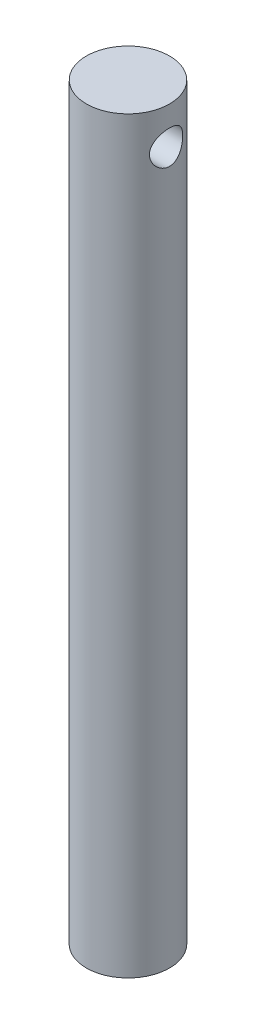
ISO-10303-21;
HEADER;
FILE_DESCRIPTION(('STEP AP214'),'2;1');
FILE_NAME('part.step','',(''),(''),'','','');
FILE_SCHEMA(('AUTOMOTIVE_DESIGN { 1 0 10303 214 1 1 1 1 }'));
ENDSEC;
DATA;
#1=APPLICATION_CONTEXT('core data for automotive mechanical design processes');
#2=APPLICATION_PROTOCOL_DEFINITION('international standard','automotive_design',2000,#1);
#3=PRODUCT_CONTEXT('',#1,'mechanical');
#4=PRODUCT('Part','Part','',(#3));
#5=PRODUCT_RELATED_PRODUCT_CATEGORY('part','',(#4));
#6=PRODUCT_DEFINITION_FORMATION('','',#4);
#7=PRODUCT_DEFINITION_CONTEXT('part definition',#1,'design');
#8=PRODUCT_DEFINITION('design','',#6,#7);
#9=PRODUCT_DEFINITION_SHAPE('','',#8);
#10=(LENGTH_UNIT() NAMED_UNIT(*) SI_UNIT(.MILLI.,.METRE.));
#11=(NAMED_UNIT(*) PLANE_ANGLE_UNIT() SI_UNIT($,.RADIAN.));
#12=(NAMED_UNIT(*) SI_UNIT($,.STERADIAN.) SOLID_ANGLE_UNIT());
#13=UNCERTAINTY_MEASURE_WITH_UNIT(LENGTH_MEASURE(1.E-05),#10,'distance_accuracy_value','');
#14=(GEOMETRIC_REPRESENTATION_CONTEXT(3) GLOBAL_UNCERTAINTY_ASSIGNED_CONTEXT((#13)) GLOBAL_UNIT_ASSIGNED_CONTEXT((#10,
#11,#12)) REPRESENTATION_CONTEXT('',''));
#15=CARTESIAN_POINT('',(0.,0.,0.));
#16=DIRECTION('',(0.,0.,1.));
#17=DIRECTION('',(1.,0.,0.));
#18=AXIS2_PLACEMENT_3D('',#15,#16,#17);
#19=CARTESIAN_POINT('',(0.,180.,0.));
#20=DIRECTION('',(0.,-1.,0.));
#21=DIRECTION('',(0.,0.,-1.));
#22=AXIS2_PLACEMENT_3D('',#19,#20,#21);
#23=CYLINDRICAL_SURFACE('',#22,10.);
#24=CARTESIAN_POINT('',(-10.,167.,0.));
#25=CARTESIAN_POINT('',(-9.99999886871264,167.000001574933,-0.107549581345537));
#26=CARTESIAN_POINT('',(-9.99825999367799,167.00434367108,-0.215132147940362));
#27=CARTESIAN_POINT('',(-9.99134740691108,167.021673382784,-0.429535200549549));
#28=CARTESIAN_POINT('',(-9.98617152790588,167.034666453403,-0.536355162703302));
#29=CARTESIAN_POINT('',(-9.97250573560117,167.069208034551,-0.748635856497416));
#30=CARTESIAN_POINT('',(-9.96400865312143,167.09077505462,-0.854093134440868));
#31=CARTESIAN_POINT('',(-9.94393017211574,167.142241730437,-1.06266761114009));
#32=CARTESIAN_POINT('',(-9.932347522545,167.172144766255,-1.16578384227259));
#33=CARTESIAN_POINT('',(-9.89349112162205,167.273722808716,-1.46979509681069));
#34=CARTESIAN_POINT('',(-9.86204458846134,167.357421819006,-1.66629107461992));
#35=CARTESIAN_POINT('',(-9.79113035538708,167.55404621735,-2.04217417878101));
#36=CARTESIAN_POINT('',(-9.75166544086262,167.666961460115,-2.22156721456798));
#37=CARTESIAN_POINT('',(-9.66661825353092,167.924468754522,-2.56699339938209));
#38=CARTESIAN_POINT('',(-9.62084608086599,168.070212710576,-2.73212223266508));
#39=CARTESIAN_POINT('',(-9.52921139577231,168.386800609152,-3.03635232313263));
#40=CARTESIAN_POINT('',(-9.48334885017047,168.557656759017,-3.17544084661153));
#41=CARTESIAN_POINT('',(-9.39445587657958,168.928855968566,-3.42974847409895));
#42=CARTESIAN_POINT('',(-9.35164233015934,169.130172926064,-3.54362978572888));
#43=CARTESIAN_POINT('',(-9.2766729328807,169.551072842801,-3.73550961465235));
#44=CARTESIAN_POINT('',(-9.24451202207145,169.770647067741,-3.81352517485724));
#45=CARTESIAN_POINT('',(-9.19652715590089,170.211424655686,-3.92779760260542));
#46=CARTESIAN_POINT('',(-9.18002840771385,170.432102468088,-3.96578791979826));
#47=CARTESIAN_POINT('',(-9.16328008038142,170.877269999677,-4.00434593508728));
#48=CARTESIAN_POINT('',(-9.16302251073202,171.101757790011,-4.00493203570086));
#49=CARTESIAN_POINT('',(-9.17821000534301,171.531513342223,-3.9699787321474));
#50=CARTESIAN_POINT('',(-9.19256349925666,171.737031428766,-3.93695062778272));
#51=CARTESIAN_POINT('',(-9.23352375055553,172.13931911235,-3.83989376129508));
#52=CARTESIAN_POINT('',(-9.26013264599921,172.336087176306,-3.77585958980135));
#53=CARTESIAN_POINT('',(-9.32318970221161,172.720035672292,-3.61738946491141));
#54=CARTESIAN_POINT('',(-9.35982758573423,172.906938478082,-3.5223597245794));
#55=CARTESIAN_POINT('',(-9.43876232767926,173.26283163275,-3.30501292151571));
#56=CARTESIAN_POINT('',(-9.48106130910411,173.431815218813,-3.18268561021591));
#57=CARTESIAN_POINT('',(-9.57053473488081,173.760819457596,-2.90310119889357));
#58=CARTESIAN_POINT('',(-9.61783329953252,173.91913745889,-2.74387492593718));
#59=CARTESIAN_POINT('',(-9.70919649915615,174.207368956006,-2.4006288548645));
#60=CARTESIAN_POINT('',(-9.75326048890393,174.337276794821,-2.21660413066997));
#61=CARTESIAN_POINT('',(-9.83429362529358,174.567234894831,-1.82415530521055));
#62=CARTESIAN_POINT('',(-9.87110540190899,174.666644562394,-1.61532098269266));
#63=CARTESIAN_POINT('',(-9.93229656657448,174.828335722156,-1.18204753096607));
#64=CARTESIAN_POINT('',(-9.95668226924746,174.890636075115,-0.957616393699408));
#65=CARTESIAN_POINT('',(-9.98912279013839,174.972896590839,-0.513791775215602));
#66=CARTESIAN_POINT('',(-9.99805891667034,174.995144908507,-0.294886587971151));
#67=CARTESIAN_POINT('',(-10.0013695702126,175.003426201057,0.143690619615697));
#68=CARTESIAN_POINT('',(-9.99574787164577,174.989468563095,0.363362426448175));
#69=CARTESIAN_POINT('',(-9.97115134127512,174.927416494896,0.786865478243648));
#70=CARTESIAN_POINT('',(-9.95278782691064,174.880884039297,0.990964983549754));
#71=CARTESIAN_POINT('',(-9.90518882810983,174.757128583381,1.38827085612274));
#72=CARTESIAN_POINT('',(-9.87595194712999,174.679901640665,1.58147582045412));
#73=CARTESIAN_POINT('',(-9.80833189541687,174.494430120638,1.95815757162884));
#74=CARTESIAN_POINT('',(-9.76969631959847,174.385309055905,2.14115604549354));
#75=CARTESIAN_POINT('',(-9.68746729490809,174.140119352197,2.4868871825104));
#76=CARTESIAN_POINT('',(-9.64387186219642,174.004039914186,2.64961168158684));
#77=CARTESIAN_POINT('',(-9.55290235277181,173.698259974067,2.96144608598878));
#78=CARTESIAN_POINT('',(-9.50546882853787,173.526932916859,3.10894786734726));
#79=CARTESIAN_POINT('',(-9.4148334583058,173.16111983411,3.37350239509235));
#80=CARTESIAN_POINT('',(-9.37163231039242,172.966629999801,3.4905501236659));
#81=CARTESIAN_POINT('',(-9.2942859982933,172.557076610327,3.69161500286276));
#82=CARTESIAN_POINT('',(-9.26023261821741,172.341831999756,3.77530118531766));
#83=CARTESIAN_POINT('',(-9.20647346903737,171.898532698387,3.90459244315908));
#84=CARTESIAN_POINT('',(-9.18675711197461,171.670487595158,3.95022562452798));
#85=CARTESIAN_POINT('',(-9.16543518780389,171.225744190156,3.99943122157417));
#86=CARTESIAN_POINT('',(-9.16262842667612,171.009410298105,4.0057941177721));
#87=CARTESIAN_POINT('',(-9.17229671415009,170.578910307279,3.98360636538275));
#88=CARTESIAN_POINT('',(-9.18476982225497,170.364743936718,3.9550601501471));
#89=CARTESIAN_POINT('',(-9.2225330048627,169.95333553911,3.8661425648813));
#90=CARTESIAN_POINT('',(-9.2472967218297,169.755759153779,3.80707437387707));
#91=CARTESIAN_POINT('',(-9.30647993934965,169.37324303821,3.66001151041638));
#92=CARTESIAN_POINT('',(-9.34090210615104,169.188306814889,3.57200884934551));
#93=CARTESIAN_POINT('',(-9.4179725282647,168.824779589291,3.36374310804135));
#94=CARTESIAN_POINT('',(-9.46097893410836,168.647158169312,3.24192140926545));
#95=CARTESIAN_POINT('',(-9.54927479921251,168.314017857375,2.97179350239179));
#96=CARTESIAN_POINT('',(-9.59456494363941,168.15850565271,2.82347931168582));
#97=CARTESIAN_POINT('',(-9.68587647140964,167.863576407469,2.49297412446701));
#98=CARTESIAN_POINT('',(-9.73175488236392,167.725856616018,2.30921017071957));
#99=CARTESIAN_POINT('',(-9.7949502762577,167.543951891062,2.01716584575534));
#100=CARTESIAN_POINT('',(-9.81509269692655,167.487392936147,1.91699501972425));
#101=CARTESIAN_POINT('',(-9.85294835133019,167.382962004595,1.71180110982479));
#102=CARTESIAN_POINT('',(-9.87066269647665,167.335086050192,1.60678027559742));
#103=CARTESIAN_POINT('',(-9.9028559935491,167.249252015315,1.39454646904328));
#104=CARTESIAN_POINT('',(-9.91738778532477,167.211129845253,1.28740777135871));
#105=CARTESIAN_POINT('',(-9.94319722915714,167.144078652279,1.06995577523382));
#106=CARTESIAN_POINT('',(-9.95447639837582,167.11514534265,0.95964398335261));
#107=CARTESIAN_POINT('',(-9.97343330649399,167.066825163851,0.736945215856827));
#108=CARTESIAN_POINT('',(-9.98112017494336,167.047414088355,0.624564263591271));
#109=CARTESIAN_POINT('',(-9.99270031578293,167.018261429334,0.398419132407595));
#110=CARTESIAN_POINT('',(-9.99659628445551,167.008512973166,0.284655994966348));
#111=CARTESIAN_POINT('',(-9.99951445883957,167.001214104427,0.11383046342549));
#112=CARTESIAN_POINT('',(-10.0000005987258,166.999999166478,0.0569198512645288));
#113=CARTESIAN_POINT('',(-10.,167.,0.));
#114=B_SPLINE_CURVE_WITH_KNOTS('',3,(#24,#25,#26,#27,#28,#29,#30,#31,#32,#33,#34,#35,#36,#37,
#38,#39,#40,#41,#42,#43,#44,#45,#46,#47,#48,#49,#50,#51,#52,#53,#54,#55,#56,#57,#58,#59,#60,#61,
#62,#63,#64,#65,#66,#67,#68,#69,#70,#71,#72,#73,#74,#75,#76,#77,#78,#79,#80,#81,#82,#83,#84,#85,
#86,#87,#88,#89,#90,#91,#92,#93,#94,#95,#96,#97,#98,#99,#100,#101,#102,#103,#104,#105,#106,#107,
#108,#109,#110,#111,#112,#113),.UNSPECIFIED.,.T.,.F.,(4,2,2,2,2,2,2,2,2,2,2,2,2,2,2,2,2,2,2,2,2,
2,2,2,2,2,2,2,2,2,2,2,2,2,2,2,2,2,2,2,2,2,2,2,4),(0.,0.322603993422156,0.645411604786482,
0.968919914471232,1.29255959093094,1.93701523385824,2.58124739027476,3.25313995292303,
3.92536021760331,4.62749749529945,5.32930078128046,5.99927442509166,6.66891844572486,
7.29195888698824,7.91510806412269,8.55097484497805,9.1870807577654,9.87235930273287,
10.5577741757964,11.2567305822579,11.9553314412776,12.6125760095619,13.2696501904034,
13.8972014302891,14.5248332988777,15.171662586967,15.8187515089811,16.50856181149,
17.1984856998767,17.8950932218183,18.5911857719204,19.2371857868567,19.8831037702626,
20.5034786899771,21.124025035105,21.7801016801356,22.4363763459696,23.1352007896785,
23.4851924266232,23.8350233218042,24.1785111324565,24.52183846562,24.8642884495951,
25.2064946871486,25.3772305569977),.UNSPECIFIED.);
#115=CARTESIAN_POINT('',(-10.,167.,0.));
#116=VERTEX_POINT('',#115);
#117=EDGE_CURVE('E10',#116,#116,#114,.T.);
#118=ORIENTED_EDGE('',*,*,#117,.T.);
#119=EDGE_LOOP('',(#118));
#120=FACE_BOUND('',#119,.T.);
#121=CARTESIAN_POINT('',(9.16515138991168,171.,-4.));
#122=CARTESIAN_POINT('',(9.16515220722506,170.892822503216,-3.99999917996685));
#123=CARTESIAN_POINT('',(9.16703782704588,170.785612140205,-3.99568627578832));
#124=CARTESIAN_POINT('',(9.17451890581268,170.571967905829,-3.97847804504316));
#125=CARTESIAN_POINT('',(9.18011663538446,170.465534550055,-3.965577465543));
#126=CARTESIAN_POINT('',(9.19485078616074,170.254064046644,-3.9312935770878));
#127=CARTESIAN_POINT('',(9.20399425848326,170.149030115151,-3.90989336356572));
#128=CARTESIAN_POINT('',(9.22551446198259,169.94131240281,-3.85883937208579));
#129=CARTESIAN_POINT('',(9.23789253541712,169.838629616898,-3.82918216740128));
#130=CARTESIAN_POINT('',(9.27920231487636,169.536010273371,-3.72849978450445));
#131=CARTESIAN_POINT('',(9.31238810193524,169.340462079036,-3.64559228099564));
#132=CARTESIAN_POINT('',(9.38629512671437,168.966198731327,-3.4508325645389));
#133=CARTESIAN_POINT('',(9.42701471853534,168.787479914109,-3.33898667159604));
#134=CARTESIAN_POINT('',(9.51401677460926,168.441488186399,-3.08264624953204));
#135=CARTESIAN_POINT('',(9.56047821792021,168.275289566711,-2.93675933272146));
#136=CARTESIAN_POINT('',(9.65224928088017,167.968939591958,-2.61941759406607));
#137=CARTESIAN_POINT('',(9.69755849326326,167.828797339245,-2.4479538749543));
#138=CARTESIAN_POINT('',(9.78406811808173,167.573187890163,-2.07601279575006));
#139=CARTESIAN_POINT('',(9.82503606295845,167.458911580031,-1.87465797803876));
#140=CARTESIAN_POINT('',(9.89607856333948,167.266312680323,-1.45365059895516));
#141=CARTESIAN_POINT('',(9.92615755049622,167.187975460567,-1.23400552632836));
#142=CARTESIAN_POINT('',(9.97076649749864,167.073317072677,-0.793932865332448));
#143=CARTESIAN_POINT('',(9.98597873479394,167.035145384002,-0.574057972725544));
#144=CARTESIAN_POINT('',(10.001606214367,166.995943016499,-0.130532654160175));
#145=CARTESIAN_POINT('',(10.0020269755724,166.994898484955,0.0931163324631064));
#146=CARTESIAN_POINT('',(9.98843925626006,167.028965542546,0.524464988663922));
#147=CARTESIAN_POINT('',(9.97523993538891,167.062049546297,0.73235490554245));
#148=CARTESIAN_POINT('',(9.93698582942363,167.159985751818,1.13934621864229));
#149=CARTESIAN_POINT('',(9.91193017443785,167.224840284584,1.33844696883603));
#150=CARTESIAN_POINT('',(9.85193648913816,167.385272965972,1.72579587696675));
#151=CARTESIAN_POINT('',(9.81685520932147,167.481299429689,1.91383524674319));
#152=CARTESIAN_POINT('',(9.7402917036085,167.70093001378,2.27161630149723));
#153=CARTESIAN_POINT('',(9.69880728534381,167.824543586184,2.44135168543995));
#154=CARTESIAN_POINT('',(9.61043274352157,168.105298271905,2.76953765597606));
#155=CARTESIAN_POINT('',(9.56336653023493,168.26410778515,2.92651569053149));
#156=CARTESIAN_POINT('',(9.47123321946549,168.605981143659,3.21221483078646));
#157=CARTESIAN_POINT('',(9.42616678016159,168.78905289639,3.34092668757428));
#158=CARTESIAN_POINT('',(9.34193794818039,169.180838044749,3.56980837743823));
#159=CARTESIAN_POINT('',(9.30297828115413,169.390129660678,3.66906930327245));
#160=CARTESIAN_POINT('',(9.23775180688171,169.824430980624,3.83035251973301));
#161=CARTESIAN_POINT('',(9.21147675782622,170.049430369453,3.89239899675599));
#162=CARTESIAN_POINT('',(9.17659519405432,170.494071554935,3.97390989770977));
#163=CARTESIAN_POINT('',(9.16700732912276,170.713200894257,3.99574419362908));
#164=CARTESIAN_POINT('',(9.16378995738077,171.152154415519,4.00312265288578));
#165=CARTESIAN_POINT('',(9.17015561120724,171.371978366551,3.98867782118258));
#166=CARTESIAN_POINT('',(9.19712088718227,171.792917869914,3.92606578958006));
#167=CARTESIAN_POINT('',(9.21688915596603,171.9943858748,3.87986612404772));
#168=CARTESIAN_POINT('',(9.26740102054679,172.386576809571,3.75760837382176));
#169=CARTESIAN_POINT('',(9.29814704977195,172.577297346215,3.6815436686046));
#170=CARTESIAN_POINT('',(9.36867563720203,172.951204715591,3.49827127896311));
#171=CARTESIAN_POINT('',(9.40877409278357,173.133772377387,3.38992573652915));
#172=CARTESIAN_POINT('',(9.49300770315588,173.478965974885,3.1463304488838));
#173=CARTESIAN_POINT('',(9.5371444979208,173.641583745598,3.01106974696435));
#174=CARTESIAN_POINT('',(9.62841831942843,173.954746817191,2.70568842336055));
#175=CARTESIAN_POINT('',(9.67553614570507,174.103513130555,2.53373085888854));
#176=CARTESIAN_POINT('',(9.76439589135024,174.370354153248,2.16616726673934));
#177=CARTESIAN_POINT('',(9.80613759186121,174.488427613297,1.97056027694193));
#178=CARTESIAN_POINT('',(9.87967431800929,174.690095252819,1.56055986799734));
#179=CARTESIAN_POINT('',(9.9114717248188,174.773697687947,1.34617096196502));
#180=CARTESIAN_POINT('',(9.96145426937248,174.903097705199,0.904787181861589));
#181=CARTESIAN_POINT('',(9.97964679410119,174.948915804313,0.677799220674816));
#182=CARTESIAN_POINT('',(9.99958016425668,174.999009401911,0.23363302061199));
#183=CARTESIAN_POINT('',(10.0023169350655,175.005800252077,0.0167809848943213));
#184=CARTESIAN_POINT('',(9.99372084740381,174.98428904628,-0.414867671174707));
#185=CARTESIAN_POINT('',(9.98239011871255,174.955992302479,-0.629664597702875));
#186=CARTESIAN_POINT('',(9.94743026789158,174.866906405787,-1.04434180494579));
#187=CARTESIAN_POINT('',(9.92418961491739,174.807142043495,-1.24447761316989));
#188=CARTESIAN_POINT('',(9.86789895440956,174.657894455242,-1.63184470564403));
#189=CARTESIAN_POINT('',(9.83484713776136,174.568405747944,-1.8190736020911));
#190=CARTESIAN_POINT('',(9.76036189588764,174.357793352432,-2.18440609879392));
#191=CARTESIAN_POINT('',(9.71862262764552,174.235446455904,-2.36174083104878));
#192=CARTESIAN_POINT('',(9.63178803063432,173.964423916364,-2.69410799958836));
#193=CARTESIAN_POINT('',(9.58669131729774,173.815737375961,-2.84913115669899));
#194=CARTESIAN_POINT('',(9.49475540255924,173.485365761134,-3.1424027582614));
#195=CARTESIAN_POINT('',(9.4479811565371,173.302207701298,-3.27901865020171));
#196=CARTESIAN_POINT('',(9.3609929250149,172.914130278752,-3.5196940249722));
#197=CARTESIAN_POINT('',(9.32077971107738,172.709208361334,-3.62374968011082));
#198=CARTESIAN_POINT('',(9.25517900642369,172.30187605622,-3.78798515690827));
#199=CARTESIAN_POINT('',(9.22878451494604,172.100892324054,-3.85126569346864));
#200=CARTESIAN_POINT('',(9.19885565843391,171.793361040209,-3.92194632104983));
#201=CARTESIAN_POINT('',(9.19049270633768,171.689926964106,-3.94146052144917));
#202=CARTESIAN_POINT('',(9.17721200341612,171.481643070389,-3.97228850679683));
#203=CARTESIAN_POINT('',(9.17229225293171,171.376794110604,-3.98360705155155));
#204=CARTESIAN_POINT('',(9.16783675423417,171.226449408648,-3.99384232103283));
#205=CARTESIAN_POINT('',(9.16683059815414,171.181200169678,-3.99615058414993));
#206=CARTESIAN_POINT('',(9.16548771864777,171.090635915785,-3.99922965337524));
#207=CARTESIAN_POINT('',(9.16515104430392,171.045320896284,-4.00000034675784));
#208=CARTESIAN_POINT('',(9.16515138991168,171.,-4.));
#209=B_SPLINE_CURVE_WITH_KNOTS('',3,(#121,#122,#123,#124,#125,#126,#127,#128,#129,#130,#131,
#132,#133,#134,#135,#136,#137,#138,#139,#140,#141,#142,#143,#144,#145,#146,#147,#148,#149,#150,
#151,#152,#153,#154,#155,#156,#157,#158,#159,#160,#161,#162,#163,#164,#165,#166,#167,#168,#169,
#170,#171,#172,#173,#174,#175,#176,#177,#178,#179,#180,#181,#182,#183,#184,#185,#186,#187,#188,
#189,#190,#191,#192,#193,#194,#195,#196,#197,#198,#199,#200,#201,#202,#203,#204,#205,#206,#207,
#208),.UNSPECIFIED.,.T.,.F.,(4,2,2,2,2,2,2,2,2,2,2,2,2,2,2,2,2,2,2,2,2,2,2,2,2,2,2,2,2,2,2,2,2,
2,2,2,2,2,2,2,2,2,2,4),(0.,0.321486083338399,0.643168995111178,0.965494918272716,
1.28795480954363,1.92974178448589,2.57138871437638,3.24631250358762,3.92147162486596,
4.6232535197277,5.32474947728873,5.9922837956428,6.65956904401257,7.28937303450519,
7.91922324048033,8.55856614259711,9.19812843669977,9.87968101952625,10.5614562804417,
11.2624893122443,11.9630662339012,12.6208430883876,13.2784204360579,13.898545099602,
14.5188073109319,15.1642232309532,15.8099024284161,16.5032748228387,17.1966754349541,
17.8899098841554,18.5827676569819,19.2304209330182,19.8779761681512,20.5056400267662,
21.1334196944708,21.7889411606976,22.4447344691832,23.1411252036114,23.8375977730829,
24.4715333542806,24.7879924179096,25.1042675432749,25.2402006430819,25.3761437083411),.UNSPECIFIED.);
#210=CARTESIAN_POINT('',(9.16515138991168,171.,-4.));
#211=VERTEX_POINT('',#210);
#212=EDGE_CURVE('E49',#211,#211,#209,.T.);
#213=ORIENTED_EDGE('',*,*,#212,.T.);
#214=EDGE_LOOP('',(#213));
#215=FACE_BOUND('',#214,.T.);
#216=CARTESIAN_POINT('',(0.,180.,0.));
#217=DIRECTION('',(0.,1.,0.));
#218=DIRECTION('',(0.,0.,1.));
#219=AXIS2_PLACEMENT_3D('',#216,#217,#218);
#220=CIRCLE('',#219,10.);
#221=CARTESIAN_POINT('',(0.,180.,10.));
#222=VERTEX_POINT('',#221);
#223=EDGE_CURVE('E54',#222,#222,#220,.T.);
#224=ORIENTED_EDGE('',*,*,#223,.F.);
#225=EDGE_LOOP('',(#224));
#226=FACE_BOUND('',#225,.T.);
#227=CARTESIAN_POINT('',(0.,0.,0.));
#228=DIRECTION('',(0.,1.,0.));
#229=DIRECTION('',(0.,0.,1.));
#230=AXIS2_PLACEMENT_3D('',#227,#228,#229);
#231=CIRCLE('',#230,10.);
#232=CARTESIAN_POINT('',(0.,0.,10.));
#233=VERTEX_POINT('',#232);
#234=EDGE_CURVE('E59',#233,#233,#231,.T.);
#235=ORIENTED_EDGE('',*,*,#234,.T.);
#236=EDGE_LOOP('',(#235));
#237=FACE_BOUND('',#236,.T.);
#238=ADVANCED_FACE('F37',(#120,#215,#226,#237),#23,.T.);
#239=CARTESIAN_POINT('',(0.,180.,0.));
#240=DIRECTION('',(0.,1.,0.));
#241=DIRECTION('',(0.,0.,1.));
#242=AXIS2_PLACEMENT_3D('',#239,#240,#241);
#243=PLANE('',#242);
#244=ORIENTED_EDGE('',*,*,#223,.T.);
#245=EDGE_LOOP('',(#244));
#246=FACE_BOUND('',#245,.T.);
#247=ADVANCED_FACE('F71',(#246),#243,.T.);
#248=CARTESIAN_POINT('',(0.,0.,0.));
#249=DIRECTION('',(0.,1.,0.));
#250=DIRECTION('',(0.,0.,1.));
#251=AXIS2_PLACEMENT_3D('',#248,#249,#250);
#252=PLANE('',#251);
#253=ORIENTED_EDGE('',*,*,#234,.F.);
#254=EDGE_LOOP('',(#253));
#255=FACE_BOUND('',#254,.T.);
#256=ADVANCED_FACE('F69',(#255),#252,.F.);
#257=CARTESIAN_POINT('',(-10.,171.,0.));
#258=DIRECTION('',(1.,0.,0.));
#259=DIRECTION('',(0.,0.,-1.));
#260=AXIS2_PLACEMENT_3D('',#257,#258,#259);
#261=CYLINDRICAL_SURFACE('',#260,4.);
#262=ORIENTED_EDGE('',*,*,#212,.F.);
#263=EDGE_LOOP('',(#262));
#264=FACE_BOUND('',#263,.T.);
#265=ORIENTED_EDGE('',*,*,#117,.F.);
#266=EDGE_LOOP('',(#265));
#267=FACE_BOUND('',#266,.T.);
#268=ADVANCED_FACE('F65',(#264,#267),#261,.F.);
#269=CLOSED_SHELL('',(#238,#247,#256,#268));
#270=MANIFOLD_SOLID_BREP('B2',#269);
#271=ADVANCED_BREP_SHAPE_REPRESENTATION('',(#18,#270),#14);
#272=SHAPE_DEFINITION_REPRESENTATION(#9,#271);
ENDSEC;
END-ISO-10303-21;
